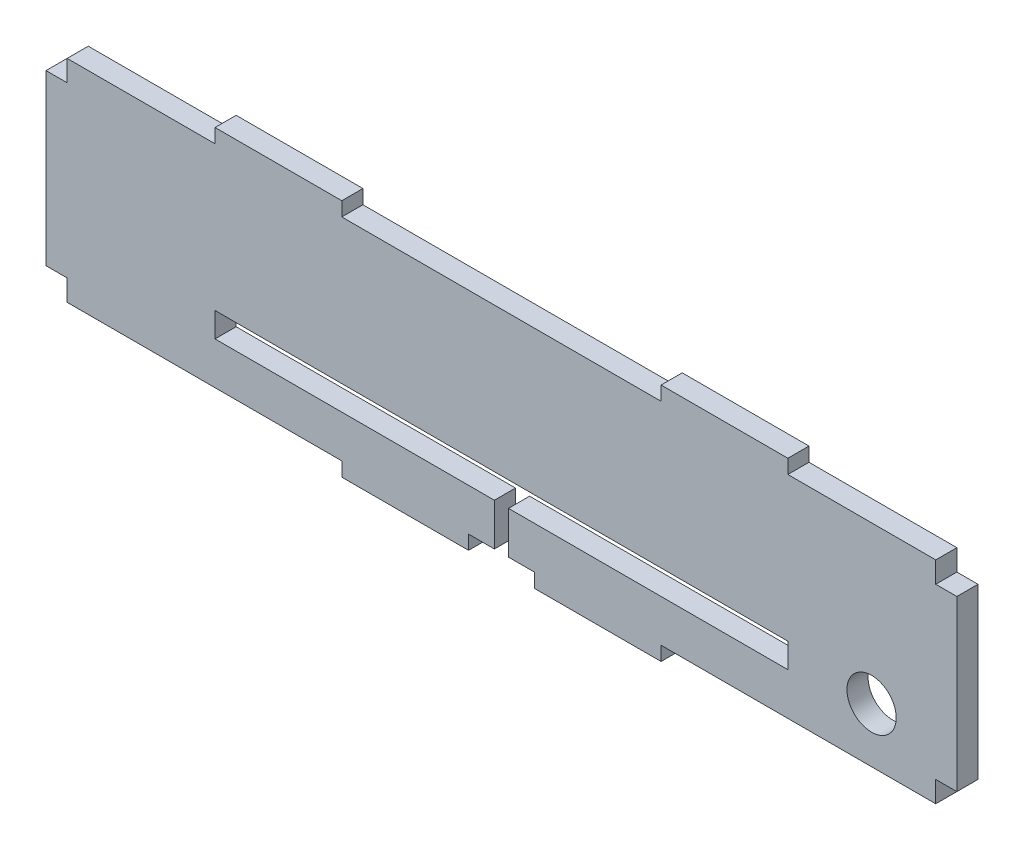
ISO-10303-21;
HEADER;
FILE_DESCRIPTION(('STEP AP214'),'2;1');
FILE_NAME('part.step','',(''),(''),'','','');
FILE_SCHEMA(('AUTOMOTIVE_DESIGN { 1 0 10303 214 1 1 1 1 }'));
ENDSEC;
DATA;
#1=APPLICATION_CONTEXT('core data for automotive mechanical design processes');
#2=APPLICATION_PROTOCOL_DEFINITION('international standard','automotive_design',2000,#1);
#3=PRODUCT_CONTEXT('',#1,'mechanical');
#4=PRODUCT('Part','Part','',(#3));
#5=PRODUCT_RELATED_PRODUCT_CATEGORY('part','',(#4));
#6=PRODUCT_DEFINITION_FORMATION('','',#4);
#7=PRODUCT_DEFINITION_CONTEXT('part definition',#1,'design');
#8=PRODUCT_DEFINITION('design','',#6,#7);
#9=PRODUCT_DEFINITION_SHAPE('','',#8);
#10=(LENGTH_UNIT() NAMED_UNIT(*) SI_UNIT(.MILLI.,.METRE.));
#11=(NAMED_UNIT(*) PLANE_ANGLE_UNIT() SI_UNIT($,.RADIAN.));
#12=(NAMED_UNIT(*) SI_UNIT($,.STERADIAN.) SOLID_ANGLE_UNIT());
#13=UNCERTAINTY_MEASURE_WITH_UNIT(LENGTH_MEASURE(1.E-05),#10,'distance_accuracy_value','');
#14=(GEOMETRIC_REPRESENTATION_CONTEXT(3) GLOBAL_UNCERTAINTY_ASSIGNED_CONTEXT((#13)) GLOBAL_UNIT_ASSIGNED_CONTEXT((#10,
#11,#12)) REPRESENTATION_CONTEXT('',''));
#15=CARTESIAN_POINT('',(0.,0.,0.));
#16=DIRECTION('',(0.,0.,1.));
#17=DIRECTION('',(1.,0.,0.));
#18=AXIS2_PLACEMENT_3D('',#15,#16,#17);
#19=CARTESIAN_POINT('',(0.,30.,3.));
#20=DIRECTION('',(0.,1.,0.));
#21=DIRECTION('',(0.,0.,1.));
#22=AXIS2_PLACEMENT_3D('',#19,#20,#21);
#23=PLANE('',#22);
#24=DIRECTION('',(1.,0.,0.));
#25=VECTOR('',#24,1.);
#26=CARTESIAN_POINT('',(0.,30.,0.));
#27=LINE('',#26,#25);
#28=CARTESIAN_POINT('',(3.,30.,0.));
#29=VERTEX_POINT('',#28);
#30=CARTESIAN_POINT('',(24.,30.,0.));
#31=VERTEX_POINT('',#30);
#32=EDGE_CURVE('E389',#29,#31,#27,.T.);
#33=ORIENTED_EDGE('',*,*,#32,.F.);
#34=DIRECTION('',(0.,0.,-1.));
#35=VECTOR('',#34,1.);
#36=CARTESIAN_POINT('',(3.,30.,3.));
#37=LINE('',#36,#35);
#38=CARTESIAN_POINT('',(3.,30.,3.));
#39=VERTEX_POINT('',#38);
#40=EDGE_CURVE('E11',#39,#29,#37,.T.);
#41=ORIENTED_EDGE('',*,*,#40,.F.);
#42=DIRECTION('',(1.,0.,0.));
#43=VECTOR('',#42,1.);
#44=CARTESIAN_POINT('',(0.,30.,3.));
#45=LINE('',#44,#43);
#46=CARTESIAN_POINT('',(24.,30.,3.));
#47=VERTEX_POINT('',#46);
#48=EDGE_CURVE('E1070',#39,#47,#45,.T.);
#49=ORIENTED_EDGE('',*,*,#48,.T.);
#50=DIRECTION('',(0.,0.,-1.));
#51=VECTOR('',#50,1.);
#52=CARTESIAN_POINT('',(24.,30.,3.));
#53=LINE('',#52,#51);
#54=EDGE_CURVE('E54',#47,#31,#53,.T.);
#55=ORIENTED_EDGE('',*,*,#54,.T.);
#56=EDGE_LOOP('',(#33,#41,#49,#55));
#57=FACE_BOUND('',#56,.T.);
#58=ADVANCED_FACE('F37',(#57),#23,.T.);
#59=CARTESIAN_POINT('',(3.,0.,3.));
#60=DIRECTION('',(1.,0.,0.));
#61=DIRECTION('',(0.,0.,-1.));
#62=AXIS2_PLACEMENT_3D('',#59,#60,#61);
#63=PLANE('',#62);
#64=DIRECTION('',(0.,-1.,0.));
#65=VECTOR('',#64,1.);
#66=CARTESIAN_POINT('',(3.,0.,0.));
#67=LINE('',#66,#65);
#68=CARTESIAN_POINT('',(3.,27.,0.));
#69=VERTEX_POINT('',#68);
#70=EDGE_CURVE('E386',#29,#69,#67,.T.);
#71=ORIENTED_EDGE('',*,*,#70,.T.);
#72=DIRECTION('',(0.,0.,-1.));
#73=VECTOR('',#72,1.);
#74=CARTESIAN_POINT('',(3.,27.,3.));
#75=LINE('',#74,#73);
#76=CARTESIAN_POINT('',(3.,27.,3.));
#77=VERTEX_POINT('',#76);
#78=EDGE_CURVE('E46',#77,#69,#75,.T.);
#79=ORIENTED_EDGE('',*,*,#78,.F.);
#80=DIRECTION('',(0.,-1.,0.));
#81=VECTOR('',#80,1.);
#82=CARTESIAN_POINT('',(3.,0.,3.));
#83=LINE('',#82,#81);
#84=EDGE_CURVE('E1068',#39,#77,#83,.T.);
#85=ORIENTED_EDGE('',*,*,#84,.F.);
#86=ORIENTED_EDGE('',*,*,#40,.T.);
#87=EDGE_LOOP('',(#71,#79,#85,#86));
#88=FACE_BOUND('',#87,.T.);
#89=ADVANCED_FACE('F387',(#88),#63,.F.);
#90=CARTESIAN_POINT('',(0.,27.,3.));
#91=DIRECTION('',(0.,1.,0.));
#92=DIRECTION('',(0.,0.,1.));
#93=AXIS2_PLACEMENT_3D('',#90,#91,#92);
#94=PLANE('',#93);
#95=DIRECTION('',(1.,0.,0.));
#96=VECTOR('',#95,1.);
#97=CARTESIAN_POINT('',(0.,27.,0.));
#98=LINE('',#97,#96);
#99=CARTESIAN_POINT('',(0.,27.,0.));
#100=VERTEX_POINT('',#99);
#101=EDGE_CURVE('E380',#100,#69,#98,.T.);
#102=ORIENTED_EDGE('',*,*,#101,.F.);
#103=DIRECTION('',(0.,0.,-1.));
#104=VECTOR('',#103,1.);
#105=CARTESIAN_POINT('',(0.,27.,3.));
#106=LINE('',#105,#104);
#107=CARTESIAN_POINT('',(0.,27.,3.));
#108=VERTEX_POINT('',#107);
#109=EDGE_CURVE('E372',#108,#100,#106,.T.);
#110=ORIENTED_EDGE('',*,*,#109,.F.);
#111=DIRECTION('',(1.,0.,0.));
#112=VECTOR('',#111,1.);
#113=CARTESIAN_POINT('',(0.,27.,3.));
#114=LINE('',#113,#112);
#115=EDGE_CURVE('E383',#108,#77,#114,.T.);
#116=ORIENTED_EDGE('',*,*,#115,.T.);
#117=ORIENTED_EDGE('',*,*,#78,.T.);
#118=EDGE_LOOP('',(#102,#110,#116,#117));
#119=FACE_BOUND('',#118,.T.);
#120=ADVANCED_FACE('F378',(#119),#94,.T.);
#121=CARTESIAN_POINT('',(0.,0.,3.));
#122=DIRECTION('',(-1.,0.,0.));
#123=DIRECTION('',(0.,0.,1.));
#124=AXIS2_PLACEMENT_3D('',#121,#122,#123);
#125=PLANE('',#124);
#126=DIRECTION('',(0.,1.,0.));
#127=VECTOR('',#126,1.);
#128=CARTESIAN_POINT('',(0.,0.,0.));
#129=LINE('',#128,#127);
#130=CARTESIAN_POINT('',(0.,3.,0.));
#131=VERTEX_POINT('',#130);
#132=EDGE_CURVE('E394',#131,#100,#129,.T.);
#133=ORIENTED_EDGE('',*,*,#132,.F.);
#134=DIRECTION('',(0.,0.,-1.));
#135=VECTOR('',#134,1.);
#136=CARTESIAN_POINT('',(0.,3.,3.));
#137=LINE('',#136,#135);
#138=CARTESIAN_POINT('',(0.,3.,3.));
#139=VERTEX_POINT('',#138);
#140=EDGE_CURVE('E370',#139,#131,#137,.T.);
#141=ORIENTED_EDGE('',*,*,#140,.F.);
#142=DIRECTION('',(0.,1.,0.));
#143=VECTOR('',#142,1.);
#144=CARTESIAN_POINT('',(0.,0.,3.));
#145=LINE('',#144,#143);
#146=EDGE_CURVE('E1064',#139,#108,#145,.T.);
#147=ORIENTED_EDGE('',*,*,#146,.T.);
#148=ORIENTED_EDGE('',*,*,#109,.T.);
#149=EDGE_LOOP('',(#133,#141,#147,#148));
#150=FACE_BOUND('',#149,.T.);
#151=ADVANCED_FACE('F514',(#150),#125,.T.);
#152=CARTESIAN_POINT('',(0.,3.,3.));
#153=DIRECTION('',(0.,1.,0.));
#154=DIRECTION('',(0.,0.,1.));
#155=AXIS2_PLACEMENT_3D('',#152,#153,#154);
#156=PLANE('',#155);
#157=DIRECTION('',(1.,0.,0.));
#158=VECTOR('',#157,1.);
#159=CARTESIAN_POINT('',(0.,3.,0.));
#160=LINE('',#159,#158);
#161=CARTESIAN_POINT('',(3.,3.,0.));
#162=VERTEX_POINT('',#161);
#163=EDGE_CURVE('E396',#131,#162,#160,.T.);
#164=ORIENTED_EDGE('',*,*,#163,.T.);
#165=DIRECTION('',(0.,0.,-1.));
#166=VECTOR('',#165,1.);
#167=CARTESIAN_POINT('',(3.,3.,3.));
#168=LINE('',#167,#166);
#169=CARTESIAN_POINT('',(3.,3.,3.));
#170=VERTEX_POINT('',#169);
#171=EDGE_CURVE('E368',#170,#162,#168,.T.);
#172=ORIENTED_EDGE('',*,*,#171,.F.);
#173=DIRECTION('',(1.,0.,0.));
#174=VECTOR('',#173,1.);
#175=CARTESIAN_POINT('',(0.,3.,3.));
#176=LINE('',#175,#174);
#177=EDGE_CURVE('E1062',#139,#170,#176,.T.);
#178=ORIENTED_EDGE('',*,*,#177,.F.);
#179=ORIENTED_EDGE('',*,*,#140,.T.);
#180=EDGE_LOOP('',(#164,#172,#178,#179));
#181=FACE_BOUND('',#180,.T.);
#182=ADVANCED_FACE('F517',(#181),#156,.F.);
#183=CARTESIAN_POINT('',(3.,0.,3.));
#184=DIRECTION('',(-1.,0.,0.));
#185=DIRECTION('',(0.,0.,1.));
#186=AXIS2_PLACEMENT_3D('',#183,#184,#185);
#187=PLANE('',#186);
#188=DIRECTION('',(0.,1.,0.));
#189=VECTOR('',#188,1.);
#190=CARTESIAN_POINT('',(3.,0.,0.));
#191=LINE('',#190,#189);
#192=CARTESIAN_POINT('',(3.,0.,0.));
#193=VERTEX_POINT('',#192);
#194=EDGE_CURVE('E402',#193,#162,#191,.T.);
#195=ORIENTED_EDGE('',*,*,#194,.F.);
#196=DIRECTION('',(0.,0.,-1.));
#197=VECTOR('',#196,1.);
#198=CARTESIAN_POINT('',(3.,0.,3.));
#199=LINE('',#198,#197);
#200=CARTESIAN_POINT('',(3.,0.,3.));
#201=VERTEX_POINT('',#200);
#202=EDGE_CURVE('E366',#201,#193,#199,.T.);
#203=ORIENTED_EDGE('',*,*,#202,.F.);
#204=DIRECTION('',(0.,1.,0.));
#205=VECTOR('',#204,1.);
#206=CARTESIAN_POINT('',(3.,0.,3.));
#207=LINE('',#206,#205);
#208=EDGE_CURVE('E1059',#201,#170,#207,.T.);
#209=ORIENTED_EDGE('',*,*,#208,.T.);
#210=ORIENTED_EDGE('',*,*,#171,.T.);
#211=EDGE_LOOP('',(#195,#203,#209,#210));
#212=FACE_BOUND('',#211,.T.);
#213=ADVANCED_FACE('F521',(#212),#187,.T.);
#214=CARTESIAN_POINT('',(0.,0.,3.));
#215=DIRECTION('',(0.,1.,0.));
#216=DIRECTION('',(0.,0.,1.));
#217=AXIS2_PLACEMENT_3D('',#214,#215,#216);
#218=PLANE('',#217);
#219=DIRECTION('',(1.,0.,0.));
#220=VECTOR('',#219,1.);
#221=CARTESIAN_POINT('',(0.,0.,0.));
#222=LINE('',#221,#220);
#223=CARTESIAN_POINT('',(42.,0.,0.));
#224=VERTEX_POINT('',#223);
#225=EDGE_CURVE('E405',#193,#224,#222,.T.);
#226=ORIENTED_EDGE('',*,*,#225,.T.);
#227=DIRECTION('',(0.,0.,-1.));
#228=VECTOR('',#227,1.);
#229=CARTESIAN_POINT('',(42.,0.,3.));
#230=LINE('',#229,#228);
#231=CARTESIAN_POINT('',(42.,0.,3.));
#232=VERTEX_POINT('',#231);
#233=EDGE_CURVE('E363',#232,#224,#230,.T.);
#234=ORIENTED_EDGE('',*,*,#233,.F.);
#235=DIRECTION('',(1.,0.,0.));
#236=VECTOR('',#235,1.);
#237=CARTESIAN_POINT('',(0.,0.,3.));
#238=LINE('',#237,#236);
#239=EDGE_CURVE('E1056',#201,#232,#238,.T.);
#240=ORIENTED_EDGE('',*,*,#239,.F.);
#241=ORIENTED_EDGE('',*,*,#202,.T.);
#242=EDGE_LOOP('',(#226,#234,#240,#241));
#243=FACE_BOUND('',#242,.T.);
#244=ADVANCED_FACE('F525',(#243),#218,.F.);
#245=CARTESIAN_POINT('',(42.,2.91433543964104E-13,3.));
#246=DIRECTION('',(1.,0.,0.));
#247=DIRECTION('',(0.,1.,0.));
#248=AXIS2_PLACEMENT_3D('',#245,#246,#247);
#249=PLANE('',#248);
#250=DIRECTION('',(0.,-1.,0.));
#251=VECTOR('',#250,1.);
#252=CARTESIAN_POINT('',(42.,2.91433543964104E-13,0.));
#253=LINE('',#252,#251);
#254=CARTESIAN_POINT('',(42.,-2.,0.));
#255=VERTEX_POINT('',#254);
#256=EDGE_CURVE('E408',#224,#255,#253,.T.);
#257=ORIENTED_EDGE('',*,*,#256,.T.);
#258=DIRECTION('',(0.,0.,-1.));
#259=VECTOR('',#258,1.);
#260=CARTESIAN_POINT('',(42.,-2.,3.));
#261=LINE('',#260,#259);
#262=CARTESIAN_POINT('',(42.,-2.,3.));
#263=VERTEX_POINT('',#262);
#264=EDGE_CURVE('E360',#263,#255,#261,.T.);
#265=ORIENTED_EDGE('',*,*,#264,.F.);
#266=DIRECTION('',(0.,-1.,0.));
#267=VECTOR('',#266,1.);
#268=CARTESIAN_POINT('',(42.,2.91433543964104E-13,3.));
#269=LINE('',#268,#267);
#270=EDGE_CURVE('E1053',#232,#263,#269,.T.);
#271=ORIENTED_EDGE('',*,*,#270,.F.);
#272=ORIENTED_EDGE('',*,*,#233,.T.);
#273=EDGE_LOOP('',(#257,#265,#271,#272));
#274=FACE_BOUND('',#273,.T.);
#275=ADVANCED_FACE('F529',(#274),#249,.F.);
#276=CARTESIAN_POINT('',(0.,-2.,3.));
#277=DIRECTION('',(0.,1.,0.));
#278=DIRECTION('',(-1.,0.,0.));
#279=AXIS2_PLACEMENT_3D('',#276,#277,#278);
#280=PLANE('',#279);
#281=DIRECTION('',(1.,0.,0.));
#282=VECTOR('',#281,1.);
#283=CARTESIAN_POINT('',(0.,-2.,0.));
#284=LINE('',#283,#282);
#285=CARTESIAN_POINT('',(60.,-2.,0.));
#286=VERTEX_POINT('',#285);
#287=EDGE_CURVE('E411',#255,#286,#284,.T.);
#288=ORIENTED_EDGE('',*,*,#287,.T.);
#289=DIRECTION('',(0.,0.,-1.));
#290=VECTOR('',#289,1.);
#291=CARTESIAN_POINT('',(60.,-2.,3.));
#292=LINE('',#291,#290);
#293=CARTESIAN_POINT('',(60.,-2.,3.));
#294=VERTEX_POINT('',#293);
#295=EDGE_CURVE('E357',#294,#286,#292,.T.);
#296=ORIENTED_EDGE('',*,*,#295,.F.);
#297=DIRECTION('',(1.,0.,0.));
#298=VECTOR('',#297,1.);
#299=CARTESIAN_POINT('',(0.,-2.,3.));
#300=LINE('',#299,#298);
#301=EDGE_CURVE('E961',#263,#294,#300,.T.);
#302=ORIENTED_EDGE('',*,*,#301,.F.);
#303=ORIENTED_EDGE('',*,*,#264,.T.);
#304=EDGE_LOOP('',(#288,#296,#302,#303));
#305=FACE_BOUND('',#304,.T.);
#306=ADVANCED_FACE('F533',(#305),#280,.F.);
#307=CARTESIAN_POINT('',(60.,4.16333634234434E-13,3.));
#308=DIRECTION('',(-1.,0.,0.));
#309=DIRECTION('',(0.,-1.,0.));
#310=AXIS2_PLACEMENT_3D('',#307,#308,#309);
#311=PLANE('',#310);
#312=DIRECTION('',(0.,1.,0.));
#313=VECTOR('',#312,1.);
#314=CARTESIAN_POINT('',(60.,4.16333634234434E-13,0.));
#315=LINE('',#314,#313);
#316=CARTESIAN_POINT('',(60.,0.,0.));
#317=VERTEX_POINT('',#316);
#318=EDGE_CURVE('E414',#286,#317,#315,.T.);
#319=ORIENTED_EDGE('',*,*,#318,.T.);
#320=DIRECTION('',(0.,0.,-1.));
#321=VECTOR('',#320,1.);
#322=CARTESIAN_POINT('',(60.,0.,3.));
#323=LINE('',#322,#321);
#324=CARTESIAN_POINT('',(60.,0.,3.));
#325=VERTEX_POINT('',#324);
#326=EDGE_CURVE('E354',#325,#317,#323,.T.);
#327=ORIENTED_EDGE('',*,*,#326,.F.);
#328=DIRECTION('',(0.,1.,0.));
#329=VECTOR('',#328,1.);
#330=CARTESIAN_POINT('',(60.,4.16333634234434E-13,3.));
#331=LINE('',#330,#329);
#332=EDGE_CURVE('E958',#294,#325,#331,.T.);
#333=ORIENTED_EDGE('',*,*,#332,.F.);
#334=ORIENTED_EDGE('',*,*,#295,.T.);
#335=EDGE_LOOP('',(#319,#327,#333,#334));
#336=FACE_BOUND('',#335,.T.);
#337=ADVANCED_FACE('F537',(#336),#311,.F.);
#338=CARTESIAN_POINT('',(0.,0.,3.));
#339=DIRECTION('',(0.,1.,0.));
#340=DIRECTION('',(0.,0.,1.));
#341=AXIS2_PLACEMENT_3D('',#338,#339,#340);
#342=PLANE('',#341);
#343=DIRECTION('',(1.,0.,0.));
#344=VECTOR('',#343,1.);
#345=CARTESIAN_POINT('',(0.,0.,0.));
#346=LINE('',#345,#344);
#347=CARTESIAN_POINT('',(63.67,0.,0.));
#348=VERTEX_POINT('',#347);
#349=EDGE_CURVE('E417',#317,#348,#346,.T.);
#350=ORIENTED_EDGE('',*,*,#349,.T.);
#351=DIRECTION('',(0.,0.,-1.));
#352=VECTOR('',#351,1.);
#353=CARTESIAN_POINT('',(63.67,0.,3.));
#354=LINE('',#353,#352);
#355=CARTESIAN_POINT('',(63.67,0.,3.));
#356=VERTEX_POINT('',#355);
#357=EDGE_CURVE('E351',#356,#348,#354,.T.);
#358=ORIENTED_EDGE('',*,*,#357,.F.);
#359=DIRECTION('',(1.,0.,0.));
#360=VECTOR('',#359,1.);
#361=CARTESIAN_POINT('',(0.,0.,3.));
#362=LINE('',#361,#360);
#363=EDGE_CURVE('E954',#325,#356,#362,.T.);
#364=ORIENTED_EDGE('',*,*,#363,.F.);
#365=ORIENTED_EDGE('',*,*,#326,.T.);
#366=EDGE_LOOP('',(#350,#358,#364,#365));
#367=FACE_BOUND('',#366,.T.);
#368=ADVANCED_FACE('F541',(#367),#342,.F.);
#369=CARTESIAN_POINT('',(63.67,0.,3.));
#370=DIRECTION('',(-1.,0.,0.));
#371=DIRECTION('',(0.,0.,1.));
#372=AXIS2_PLACEMENT_3D('',#369,#370,#371);
#373=PLANE('',#372);
#374=DIRECTION('',(0.,1.,0.));
#375=VECTOR('',#374,1.);
#376=CARTESIAN_POINT('',(63.67,0.,0.));
#377=LINE('',#376,#375);
#378=CARTESIAN_POINT('',(63.67,6.,0.));
#379=VERTEX_POINT('',#378);
#380=EDGE_CURVE('E420',#348,#379,#377,.T.);
#381=ORIENTED_EDGE('',*,*,#380,.T.);
#382=DIRECTION('',(0.,0.,-1.));
#383=VECTOR('',#382,1.);
#384=CARTESIAN_POINT('',(63.67,6.,3.));
#385=LINE('',#384,#383);
#386=CARTESIAN_POINT('',(63.67,6.,3.));
#387=VERTEX_POINT('',#386);
#388=EDGE_CURVE('E349',#387,#379,#385,.T.);
#389=ORIENTED_EDGE('',*,*,#388,.F.);
#390=DIRECTION('',(0.,1.,0.));
#391=VECTOR('',#390,1.);
#392=CARTESIAN_POINT('',(63.67,0.,3.));
#393=LINE('',#392,#391);
#394=EDGE_CURVE('E949',#356,#387,#393,.T.);
#395=ORIENTED_EDGE('',*,*,#394,.F.);
#396=ORIENTED_EDGE('',*,*,#357,.T.);
#397=EDGE_LOOP('',(#381,#389,#395,#396));
#398=FACE_BOUND('',#397,.T.);
#399=ADVANCED_FACE('F543',(#398),#373,.F.);
#400=CARTESIAN_POINT('',(0.,6.,3.));
#401=DIRECTION('',(0.,1.,0.));
#402=DIRECTION('',(0.,0.,1.));
#403=AXIS2_PLACEMENT_3D('',#400,#401,#402);
#404=PLANE('',#403);
#405=DIRECTION('',(1.,0.,0.));
#406=VECTOR('',#405,1.);
#407=CARTESIAN_POINT('',(0.,6.,0.));
#408=LINE('',#407,#406);
#409=CARTESIAN_POINT('',(24.,6.,0.));
#410=VERTEX_POINT('',#409);
#411=EDGE_CURVE('E424',#410,#379,#408,.T.);
#412=ORIENTED_EDGE('',*,*,#411,.F.);
#413=DIRECTION('',(0.,0.,-1.));
#414=VECTOR('',#413,1.);
#415=CARTESIAN_POINT('',(24.,6.,3.));
#416=LINE('',#415,#414);
#417=CARTESIAN_POINT('',(24.,6.,3.));
#418=VERTEX_POINT('',#417);
#419=EDGE_CURVE('E347',#418,#410,#416,.T.);
#420=ORIENTED_EDGE('',*,*,#419,.F.);
#421=DIRECTION('',(1.,0.,0.));
#422=VECTOR('',#421,1.);
#423=CARTESIAN_POINT('',(0.,6.,3.));
#424=LINE('',#423,#422);
#425=EDGE_CURVE('E953',#418,#387,#424,.T.);
#426=ORIENTED_EDGE('',*,*,#425,.T.);
#427=ORIENTED_EDGE('',*,*,#388,.T.);
#428=EDGE_LOOP('',(#412,#420,#426,#427));
#429=FACE_BOUND('',#428,.T.);
#430=ADVANCED_FACE('F546',(#429),#404,.T.);
#431=CARTESIAN_POINT('',(24.,0.,3.));
#432=DIRECTION('',(1.,0.,0.));
#433=DIRECTION('',(0.,0.,-1.));
#434=AXIS2_PLACEMENT_3D('',#431,#432,#433);
#435=PLANE('',#434);
#436=DIRECTION('',(0.,-1.,0.));
#437=VECTOR('',#436,1.);
#438=CARTESIAN_POINT('',(24.,0.,0.));
#439=LINE('',#438,#437);
#440=CARTESIAN_POINT('',(24.,9.5,0.));
#441=VERTEX_POINT('',#440);
#442=EDGE_CURVE('E427',#441,#410,#439,.T.);
#443=ORIENTED_EDGE('',*,*,#442,.F.);
#444=DIRECTION('',(0.,0.,-1.));
#445=VECTOR('',#444,1.);
#446=CARTESIAN_POINT('',(24.,9.5,3.));
#447=LINE('',#446,#445);
#448=CARTESIAN_POINT('',(24.,9.5,3.));
#449=VERTEX_POINT('',#448);
#450=EDGE_CURVE('E345',#449,#441,#447,.T.);
#451=ORIENTED_EDGE('',*,*,#450,.F.);
#452=DIRECTION('',(0.,-1.,0.));
#453=VECTOR('',#452,1.);
#454=CARTESIAN_POINT('',(24.,0.,3.));
#455=LINE('',#454,#453);
#456=EDGE_CURVE('E1046',#449,#418,#455,.T.);
#457=ORIENTED_EDGE('',*,*,#456,.T.);
#458=ORIENTED_EDGE('',*,*,#419,.T.);
#459=EDGE_LOOP('',(#443,#451,#457,#458));
#460=FACE_BOUND('',#459,.T.);
#461=ADVANCED_FACE('F550',(#460),#435,.T.);
#462=CARTESIAN_POINT('',(0.,9.5,3.));
#463=DIRECTION('',(0.,1.,0.));
#464=DIRECTION('',(0.,0.,1.));
#465=AXIS2_PLACEMENT_3D('',#462,#463,#464);
#466=PLANE('',#465);
#467=DIRECTION('',(1.,0.,0.));
#468=VECTOR('',#467,1.);
#469=CARTESIAN_POINT('',(0.,9.5,0.));
#470=LINE('',#469,#468);
#471=CARTESIAN_POINT('',(105.34,9.5,0.));
#472=VERTEX_POINT('',#471);
#473=EDGE_CURVE('E430',#441,#472,#470,.T.);
#474=ORIENTED_EDGE('',*,*,#473,.T.);
#475=DIRECTION('',(0.,0.,-1.));
#476=VECTOR('',#475,1.);
#477=CARTESIAN_POINT('',(105.34,9.5,3.));
#478=LINE('',#477,#476);
#479=CARTESIAN_POINT('',(105.34,9.5,3.));
#480=VERTEX_POINT('',#479);
#481=EDGE_CURVE('E342',#480,#472,#478,.T.);
#482=ORIENTED_EDGE('',*,*,#481,.F.);
#483=DIRECTION('',(1.,0.,0.));
#484=VECTOR('',#483,1.);
#485=CARTESIAN_POINT('',(0.,9.5,3.));
#486=LINE('',#485,#484);
#487=EDGE_CURVE('E1048',#449,#480,#486,.T.);
#488=ORIENTED_EDGE('',*,*,#487,.F.);
#489=ORIENTED_EDGE('',*,*,#450,.T.);
#490=EDGE_LOOP('',(#474,#482,#488,#489));
#491=FACE_BOUND('',#490,.T.);
#492=ADVANCED_FACE('F554',(#491),#466,.F.);
#493=CARTESIAN_POINT('',(105.34,0.,3.));
#494=DIRECTION('',(1.,0.,0.));
#495=DIRECTION('',(0.,0.,-1.));
#496=AXIS2_PLACEMENT_3D('',#493,#494,#495);
#497=PLANE('',#496);
#498=DIRECTION('',(0.,-1.,0.));
#499=VECTOR('',#498,1.);
#500=CARTESIAN_POINT('',(105.34,0.,0.));
#501=LINE('',#500,#499);
#502=CARTESIAN_POINT('',(105.34,6.,0.));
#503=VERTEX_POINT('',#502);
#504=EDGE_CURVE('E433',#472,#503,#501,.T.);
#505=ORIENTED_EDGE('',*,*,#504,.T.);
#506=DIRECTION('',(0.,0.,-1.));
#507=VECTOR('',#506,1.);
#508=CARTESIAN_POINT('',(105.34,6.,3.));
#509=LINE('',#508,#507);
#510=CARTESIAN_POINT('',(105.34,6.,3.));
#511=VERTEX_POINT('',#510);
#512=EDGE_CURVE('E340',#511,#503,#509,.T.);
#513=ORIENTED_EDGE('',*,*,#512,.F.);
#514=DIRECTION('',(0.,-1.,0.));
#515=VECTOR('',#514,1.);
#516=CARTESIAN_POINT('',(105.34,0.,3.));
#517=LINE('',#516,#515);
#518=EDGE_CURVE('E976',#480,#511,#517,.T.);
#519=ORIENTED_EDGE('',*,*,#518,.F.);
#520=ORIENTED_EDGE('',*,*,#481,.T.);
#521=EDGE_LOOP('',(#505,#513,#519,#520));
#522=FACE_BOUND('',#521,.T.);
#523=ADVANCED_FACE('F558',(#522),#497,.F.);
#524=CARTESIAN_POINT('',(0.,6.,3.));
#525=DIRECTION('',(0.,1.,0.));
#526=DIRECTION('',(0.,0.,1.));
#527=AXIS2_PLACEMENT_3D('',#524,#525,#526);
#528=PLANE('',#527);
#529=DIRECTION('',(1.,0.,0.));
#530=VECTOR('',#529,1.);
#531=CARTESIAN_POINT('',(0.,6.,0.));
#532=LINE('',#531,#530);
#533=CARTESIAN_POINT('',(65.67,6.,0.));
#534=VERTEX_POINT('',#533);
#535=EDGE_CURVE('E436',#534,#503,#532,.T.);
#536=ORIENTED_EDGE('',*,*,#535,.F.);
#537=DIRECTION('',(0.,0.,-1.));
#538=VECTOR('',#537,1.);
#539=CARTESIAN_POINT('',(65.67,6.,3.));
#540=LINE('',#539,#538);
#541=CARTESIAN_POINT('',(65.67,6.,3.));
#542=VERTEX_POINT('',#541);
#543=EDGE_CURVE('E338',#542,#534,#540,.T.);
#544=ORIENTED_EDGE('',*,*,#543,.F.);
#545=DIRECTION('',(1.,0.,0.));
#546=VECTOR('',#545,1.);
#547=CARTESIAN_POINT('',(0.,6.,3.));
#548=LINE('',#547,#546);
#549=EDGE_CURVE('E973',#542,#511,#548,.T.);
#550=ORIENTED_EDGE('',*,*,#549,.T.);
#551=ORIENTED_EDGE('',*,*,#512,.T.);
#552=EDGE_LOOP('',(#536,#544,#550,#551));
#553=FACE_BOUND('',#552,.T.);
#554=ADVANCED_FACE('F562',(#553),#528,.T.);
#555=CARTESIAN_POINT('',(65.67,0.,3.));
#556=DIRECTION('',(-1.,0.,0.));
#557=DIRECTION('',(0.,0.,1.));
#558=AXIS2_PLACEMENT_3D('',#555,#556,#557);
#559=PLANE('',#558);
#560=DIRECTION('',(0.,1.,0.));
#561=VECTOR('',#560,1.);
#562=CARTESIAN_POINT('',(65.67,0.,0.));
#563=LINE('',#562,#561);
#564=CARTESIAN_POINT('',(65.67,0.,0.));
#565=VERTEX_POINT('',#564);
#566=EDGE_CURVE('E439',#565,#534,#563,.T.);
#567=ORIENTED_EDGE('',*,*,#566,.F.);
#568=DIRECTION('',(0.,0.,-1.));
#569=VECTOR('',#568,1.);
#570=CARTESIAN_POINT('',(65.67,0.,3.));
#571=LINE('',#570,#569);
#572=CARTESIAN_POINT('',(65.67,0.,3.));
#573=VERTEX_POINT('',#572);
#574=EDGE_CURVE('E336',#573,#565,#571,.T.);
#575=ORIENTED_EDGE('',*,*,#574,.F.);
#576=DIRECTION('',(0.,1.,0.));
#577=VECTOR('',#576,1.);
#578=CARTESIAN_POINT('',(65.67,0.,3.));
#579=LINE('',#578,#577);
#580=EDGE_CURVE('E965',#573,#542,#579,.T.);
#581=ORIENTED_EDGE('',*,*,#580,.T.);
#582=ORIENTED_EDGE('',*,*,#543,.T.);
#583=EDGE_LOOP('',(#567,#575,#581,#582));
#584=FACE_BOUND('',#583,.T.);
#585=ADVANCED_FACE('F566',(#584),#559,.T.);
#586=CARTESIAN_POINT('',(69.34,0.,0.));
#587=VERTEX_POINT('',#586);
#588=EDGE_CURVE('E421',#565,#587,#346,.T.);
#589=ORIENTED_EDGE('',*,*,#588,.T.);
#590=DIRECTION('',(0.,0.,-1.));
#591=VECTOR('',#590,1.);
#592=CARTESIAN_POINT('',(69.34,0.,3.));
#593=LINE('',#592,#591);
#594=CARTESIAN_POINT('',(69.34,0.,3.));
#595=VERTEX_POINT('',#594);
#596=EDGE_CURVE('E333',#595,#587,#593,.T.);
#597=ORIENTED_EDGE('',*,*,#596,.F.);
#598=EDGE_CURVE('E960',#573,#595,#362,.T.);
#599=ORIENTED_EDGE('',*,*,#598,.F.);
#600=ORIENTED_EDGE('',*,*,#574,.T.);
#601=EDGE_LOOP('',(#589,#597,#599,#600));
#602=FACE_BOUND('',#601,.T.);
#603=ADVANCED_FACE('F570',(#602),#342,.F.);
#604=CARTESIAN_POINT('',(69.34,0.,3.));
#605=DIRECTION('',(1.,0.,0.));
#606=DIRECTION('',(0.,0.,-1.));
#607=AXIS2_PLACEMENT_3D('',#604,#605,#606);
#608=PLANE('',#607);
#609=DIRECTION('',(0.,-1.,0.));
#610=VECTOR('',#609,1.);
#611=CARTESIAN_POINT('',(69.34,0.,0.));
#612=LINE('',#611,#610);
#613=CARTESIAN_POINT('',(69.34,-2.,0.));
#614=VERTEX_POINT('',#613);
#615=EDGE_CURVE('E442',#587,#614,#612,.T.);
#616=ORIENTED_EDGE('',*,*,#615,.T.);
#617=DIRECTION('',(0.,0.,-1.));
#618=VECTOR('',#617,1.);
#619=CARTESIAN_POINT('',(69.34,-2.,3.));
#620=LINE('',#619,#618);
#621=CARTESIAN_POINT('',(69.34,-2.,3.));
#622=VERTEX_POINT('',#621);
#623=EDGE_CURVE('E330',#622,#614,#620,.T.);
#624=ORIENTED_EDGE('',*,*,#623,.F.);
#625=DIRECTION('',(0.,-1.,0.));
#626=VECTOR('',#625,1.);
#627=CARTESIAN_POINT('',(69.34,0.,3.));
#628=LINE('',#627,#626);
#629=EDGE_CURVE('E964',#595,#622,#628,.T.);
#630=ORIENTED_EDGE('',*,*,#629,.F.);
#631=ORIENTED_EDGE('',*,*,#596,.T.);
#632=EDGE_LOOP('',(#616,#624,#630,#631));
#633=FACE_BOUND('',#632,.T.);
#634=ADVANCED_FACE('F574',(#633),#608,.F.);
#635=CARTESIAN_POINT('',(0.,-2.,3.));
#636=DIRECTION('',(0.,1.,0.));
#637=DIRECTION('',(0.,0.,1.));
#638=AXIS2_PLACEMENT_3D('',#635,#636,#637);
#639=PLANE('',#638);
#640=DIRECTION('',(1.,0.,0.));
#641=VECTOR('',#640,1.);
#642=CARTESIAN_POINT('',(0.,-2.,0.));
#643=LINE('',#642,#641);
#644=CARTESIAN_POINT('',(87.34,-2.,0.));
#645=VERTEX_POINT('',#644);
#646=EDGE_CURVE('E445',#614,#645,#643,.T.);
#647=ORIENTED_EDGE('',*,*,#646,.T.);
#648=DIRECTION('',(0.,0.,-1.));
#649=VECTOR('',#648,1.);
#650=CARTESIAN_POINT('',(87.34,-2.,3.));
#651=LINE('',#650,#649);
#652=CARTESIAN_POINT('',(87.34,-2.,3.));
#653=VERTEX_POINT('',#652);
#654=EDGE_CURVE('E327',#653,#645,#651,.T.);
#655=ORIENTED_EDGE('',*,*,#654,.F.);
#656=DIRECTION('',(1.,0.,0.));
#657=VECTOR('',#656,1.);
#658=CARTESIAN_POINT('',(0.,-2.,3.));
#659=LINE('',#658,#657);
#660=EDGE_CURVE('E970',#622,#653,#659,.T.);
#661=ORIENTED_EDGE('',*,*,#660,.F.);
#662=ORIENTED_EDGE('',*,*,#623,.T.);
#663=EDGE_LOOP('',(#647,#655,#661,#662));
#664=FACE_BOUND('',#663,.T.);
#665=ADVANCED_FACE('F578',(#664),#639,.F.);
#666=CARTESIAN_POINT('',(87.34,0.,3.));
#667=DIRECTION('',(-1.,0.,0.));
#668=DIRECTION('',(0.,0.,1.));
#669=AXIS2_PLACEMENT_3D('',#666,#667,#668);
#670=PLANE('',#669);
#671=DIRECTION('',(0.,1.,0.));
#672=VECTOR('',#671,1.);
#673=CARTESIAN_POINT('',(87.34,0.,0.));
#674=LINE('',#673,#672);
#675=CARTESIAN_POINT('',(87.34,0.,0.));
#676=VERTEX_POINT('',#675);
#677=EDGE_CURVE('E448',#645,#676,#674,.T.);
#678=ORIENTED_EDGE('',*,*,#677,.T.);
#679=DIRECTION('',(0.,0.,-1.));
#680=VECTOR('',#679,1.);
#681=CARTESIAN_POINT('',(87.34,0.,3.));
#682=LINE('',#681,#680);
#683=CARTESIAN_POINT('',(87.34,0.,3.));
#684=VERTEX_POINT('',#683);
#685=EDGE_CURVE('E324',#684,#676,#682,.T.);
#686=ORIENTED_EDGE('',*,*,#685,.F.);
#687=DIRECTION('',(0.,1.,0.));
#688=VECTOR('',#687,1.);
#689=CARTESIAN_POINT('',(87.34,0.,3.));
#690=LINE('',#689,#688);
#691=EDGE_CURVE('E982',#653,#684,#690,.T.);
#692=ORIENTED_EDGE('',*,*,#691,.F.);
#693=ORIENTED_EDGE('',*,*,#654,.T.);
#694=EDGE_LOOP('',(#678,#686,#692,#693));
#695=FACE_BOUND('',#694,.T.);
#696=ADVANCED_FACE('F582',(#695),#670,.F.);
#697=CARTESIAN_POINT('',(0.,0.,3.));
#698=DIRECTION('',(0.,1.,0.));
#699=DIRECTION('',(0.,0.,1.));
#700=AXIS2_PLACEMENT_3D('',#697,#698,#699);
#701=PLANE('',#700);
#702=DIRECTION('',(1.,0.,0.));
#703=VECTOR('',#702,1.);
#704=CARTESIAN_POINT('',(0.,0.,0.));
#705=LINE('',#704,#703);
#706=CARTESIAN_POINT('',(126.34,0.,0.));
#707=VERTEX_POINT('',#706);
#708=EDGE_CURVE('E451',#676,#707,#705,.T.);
#709=ORIENTED_EDGE('',*,*,#708,.T.);
#710=DIRECTION('',(0.,0.,-1.));
#711=VECTOR('',#710,1.);
#712=CARTESIAN_POINT('',(126.34,0.,3.));
#713=LINE('',#712,#711);
#714=CARTESIAN_POINT('',(126.34,0.,3.));
#715=VERTEX_POINT('',#714);
#716=EDGE_CURVE('E321',#715,#707,#713,.T.);
#717=ORIENTED_EDGE('',*,*,#716,.F.);
#718=DIRECTION('',(1.,0.,0.));
#719=VECTOR('',#718,1.);
#720=CARTESIAN_POINT('',(0.,0.,3.));
#721=LINE('',#720,#719);
#722=EDGE_CURVE('E985',#684,#715,#721,.T.);
#723=ORIENTED_EDGE('',*,*,#722,.F.);
#724=ORIENTED_EDGE('',*,*,#685,.T.);
#725=EDGE_LOOP('',(#709,#717,#723,#724));
#726=FACE_BOUND('',#725,.T.);
#727=ADVANCED_FACE('F586',(#726),#701,.F.);
#728=CARTESIAN_POINT('',(126.34,0.,3.));
#729=DIRECTION('',(-1.,0.,0.));
#730=DIRECTION('',(0.,0.,1.));
#731=AXIS2_PLACEMENT_3D('',#728,#729,#730);
#732=PLANE('',#731);
#733=DIRECTION('',(0.,1.,0.));
#734=VECTOR('',#733,1.);
#735=CARTESIAN_POINT('',(126.34,0.,0.));
#736=LINE('',#735,#734);
#737=CARTESIAN_POINT('',(126.34,3.,0.));
#738=VERTEX_POINT('',#737);
#739=EDGE_CURVE('E454',#707,#738,#736,.T.);
#740=ORIENTED_EDGE('',*,*,#739,.T.);
#741=DIRECTION('',(0.,0.,-1.));
#742=VECTOR('',#741,1.);
#743=CARTESIAN_POINT('',(126.34,3.,3.));
#744=LINE('',#743,#742);
#745=CARTESIAN_POINT('',(126.34,3.,3.));
#746=VERTEX_POINT('',#745);
#747=EDGE_CURVE('E319',#746,#738,#744,.T.);
#748=ORIENTED_EDGE('',*,*,#747,.F.);
#749=DIRECTION('',(0.,1.,0.));
#750=VECTOR('',#749,1.);
#751=CARTESIAN_POINT('',(126.34,0.,3.));
#752=LINE('',#751,#750);
#753=EDGE_CURVE('E988',#715,#746,#752,.T.);
#754=ORIENTED_EDGE('',*,*,#753,.F.);
#755=ORIENTED_EDGE('',*,*,#716,.T.);
#756=EDGE_LOOP('',(#740,#748,#754,#755));
#757=FACE_BOUND('',#756,.T.);
#758=ADVANCED_FACE('F590',(#757),#732,.F.);
#759=CARTESIAN_POINT('',(0.,3.,3.));
#760=DIRECTION('',(0.,-1.,0.));
#761=DIRECTION('',(0.,0.,-1.));
#762=AXIS2_PLACEMENT_3D('',#759,#760,#761);
#763=PLANE('',#762);
#764=DIRECTION('',(-1.,0.,0.));
#765=VECTOR('',#764,1.);
#766=CARTESIAN_POINT('',(0.,3.,0.));
#767=LINE('',#766,#765);
#768=CARTESIAN_POINT('',(129.34,3.,0.));
#769=VERTEX_POINT('',#768);
#770=EDGE_CURVE('E457',#769,#738,#767,.T.);
#771=ORIENTED_EDGE('',*,*,#770,.F.);
#772=DIRECTION('',(0.,0.,-1.));
#773=VECTOR('',#772,1.);
#774=CARTESIAN_POINT('',(129.34,3.,3.));
#775=LINE('',#774,#773);
#776=CARTESIAN_POINT('',(129.34,3.,3.));
#777=VERTEX_POINT('',#776);
#778=EDGE_CURVE('E317',#777,#769,#775,.T.);
#779=ORIENTED_EDGE('',*,*,#778,.F.);
#780=DIRECTION('',(-1.,0.,0.));
#781=VECTOR('',#780,1.);
#782=CARTESIAN_POINT('',(0.,3.,3.));
#783=LINE('',#782,#781);
#784=EDGE_CURVE('E990',#777,#746,#783,.T.);
#785=ORIENTED_EDGE('',*,*,#784,.T.);
#786=ORIENTED_EDGE('',*,*,#747,.T.);
#787=EDGE_LOOP('',(#771,#779,#785,#786));
#788=FACE_BOUND('',#787,.T.);
#789=ADVANCED_FACE('F594',(#788),#763,.T.);
#790=CARTESIAN_POINT('',(129.34,0.,3.));
#791=DIRECTION('',(-1.,0.,0.));
#792=DIRECTION('',(0.,0.,1.));
#793=AXIS2_PLACEMENT_3D('',#790,#791,#792);
#794=PLANE('',#793);
#795=DIRECTION('',(0.,1.,0.));
#796=VECTOR('',#795,1.);
#797=CARTESIAN_POINT('',(129.34,0.,0.));
#798=LINE('',#797,#796);
#799=CARTESIAN_POINT('',(129.34,27.,0.));
#800=VERTEX_POINT('',#799);
#801=EDGE_CURVE('E460',#769,#800,#798,.T.);
#802=ORIENTED_EDGE('',*,*,#801,.T.);
#803=DIRECTION('',(0.,0.,-1.));
#804=VECTOR('',#803,1.);
#805=CARTESIAN_POINT('',(129.34,27.,3.));
#806=LINE('',#805,#804);
#807=CARTESIAN_POINT('',(129.34,27.,3.));
#808=VERTEX_POINT('',#807);
#809=EDGE_CURVE('E314',#808,#800,#806,.T.);
#810=ORIENTED_EDGE('',*,*,#809,.F.);
#811=DIRECTION('',(0.,1.,0.));
#812=VECTOR('',#811,1.);
#813=CARTESIAN_POINT('',(129.34,0.,3.));
#814=LINE('',#813,#812);
#815=EDGE_CURVE('E993',#777,#808,#814,.T.);
#816=ORIENTED_EDGE('',*,*,#815,.F.);
#817=ORIENTED_EDGE('',*,*,#778,.T.);
#818=EDGE_LOOP('',(#802,#810,#816,#817));
#819=FACE_BOUND('',#818,.T.);
#820=ADVANCED_FACE('F598',(#819),#794,.F.);
#821=CARTESIAN_POINT('',(0.,27.,3.));
#822=DIRECTION('',(0.,-1.,0.));
#823=DIRECTION('',(0.,0.,-1.));
#824=AXIS2_PLACEMENT_3D('',#821,#822,#823);
#825=PLANE('',#824);
#826=DIRECTION('',(-1.,0.,0.));
#827=VECTOR('',#826,1.);
#828=CARTESIAN_POINT('',(0.,27.,0.));
#829=LINE('',#828,#827);
#830=CARTESIAN_POINT('',(126.34,27.,0.));
#831=VERTEX_POINT('',#830);
#832=EDGE_CURVE('E463',#800,#831,#829,.T.);
#833=ORIENTED_EDGE('',*,*,#832,.T.);
#834=DIRECTION('',(0.,0.,-1.));
#835=VECTOR('',#834,1.);
#836=CARTESIAN_POINT('',(126.34,27.,3.));
#837=LINE('',#836,#835);
#838=CARTESIAN_POINT('',(126.34,27.,3.));
#839=VERTEX_POINT('',#838);
#840=EDGE_CURVE('E312',#839,#831,#837,.T.);
#841=ORIENTED_EDGE('',*,*,#840,.F.);
#842=DIRECTION('',(-1.,0.,0.));
#843=VECTOR('',#842,1.);
#844=CARTESIAN_POINT('',(0.,27.,3.));
#845=LINE('',#844,#843);
#846=EDGE_CURVE('E996',#808,#839,#845,.T.);
#847=ORIENTED_EDGE('',*,*,#846,.F.);
#848=ORIENTED_EDGE('',*,*,#809,.T.);
#849=EDGE_LOOP('',(#833,#841,#847,#848));
#850=FACE_BOUND('',#849,.T.);
#851=ADVANCED_FACE('F602',(#850),#825,.F.);
#852=CARTESIAN_POINT('',(126.34,0.,3.));
#853=DIRECTION('',(1.,0.,0.));
#854=DIRECTION('',(0.,0.,-1.));
#855=AXIS2_PLACEMENT_3D('',#852,#853,#854);
#856=PLANE('',#855);
#857=DIRECTION('',(0.,-1.,0.));
#858=VECTOR('',#857,1.);
#859=CARTESIAN_POINT('',(126.34,0.,0.));
#860=LINE('',#859,#858);
#861=CARTESIAN_POINT('',(126.34,30.,0.));
#862=VERTEX_POINT('',#861);
#863=EDGE_CURVE('E466',#862,#831,#860,.T.);
#864=ORIENTED_EDGE('',*,*,#863,.F.);
#865=DIRECTION('',(0.,0.,-1.));
#866=VECTOR('',#865,1.);
#867=CARTESIAN_POINT('',(126.34,30.,3.));
#868=LINE('',#867,#866);
#869=CARTESIAN_POINT('',(126.34,30.,3.));
#870=VERTEX_POINT('',#869);
#871=EDGE_CURVE('E310',#870,#862,#868,.T.);
#872=ORIENTED_EDGE('',*,*,#871,.F.);
#873=DIRECTION('',(0.,-1.,0.));
#874=VECTOR('',#873,1.);
#875=CARTESIAN_POINT('',(126.34,0.,3.));
#876=LINE('',#875,#874);
#877=EDGE_CURVE('E998',#870,#839,#876,.T.);
#878=ORIENTED_EDGE('',*,*,#877,.T.);
#879=ORIENTED_EDGE('',*,*,#840,.T.);
#880=EDGE_LOOP('',(#864,#872,#878,#879));
#881=FACE_BOUND('',#880,.T.);
#882=ADVANCED_FACE('F606',(#881),#856,.T.);
#883=CARTESIAN_POINT('',(0.,30.,3.));
#884=DIRECTION('',(0.,-1.,0.));
#885=DIRECTION('',(0.,0.,-1.));
#886=AXIS2_PLACEMENT_3D('',#883,#884,#885);
#887=PLANE('',#886);
#888=DIRECTION('',(-1.,0.,0.));
#889=VECTOR('',#888,1.);
#890=CARTESIAN_POINT('',(0.,30.,0.));
#891=LINE('',#890,#889);
#892=CARTESIAN_POINT('',(105.34,30.,0.));
#893=VERTEX_POINT('',#892);
#894=EDGE_CURVE('E469',#862,#893,#891,.T.);
#895=ORIENTED_EDGE('',*,*,#894,.T.);
#896=DIRECTION('',(0.,0.,-1.));
#897=VECTOR('',#896,1.);
#898=CARTESIAN_POINT('',(105.34,30.,3.));
#899=LINE('',#898,#897);
#900=CARTESIAN_POINT('',(105.34,30.,3.));
#901=VERTEX_POINT('',#900);
#902=EDGE_CURVE('E307',#901,#893,#899,.T.);
#903=ORIENTED_EDGE('',*,*,#902,.F.);
#904=DIRECTION('',(-1.,0.,0.));
#905=VECTOR('',#904,1.);
#906=CARTESIAN_POINT('',(0.,30.,3.));
#907=LINE('',#906,#905);
#908=EDGE_CURVE('E1001',#870,#901,#907,.T.);
#909=ORIENTED_EDGE('',*,*,#908,.F.);
#910=ORIENTED_EDGE('',*,*,#871,.T.);
#911=EDGE_LOOP('',(#895,#903,#909,#910));
#912=FACE_BOUND('',#911,.T.);
#913=ADVANCED_FACE('F610',(#912),#887,.F.);
#914=CARTESIAN_POINT('',(105.34,0.,3.));
#915=DIRECTION('',(-1.,0.,0.));
#916=DIRECTION('',(0.,0.,1.));
#917=AXIS2_PLACEMENT_3D('',#914,#915,#916);
#918=PLANE('',#917);
#919=DIRECTION('',(0.,1.,0.));
#920=VECTOR('',#919,1.);
#921=CARTESIAN_POINT('',(105.34,0.,0.));
#922=LINE('',#921,#920);
#923=CARTESIAN_POINT('',(105.34,32.,0.));
#924=VERTEX_POINT('',#923);
#925=EDGE_CURVE('E472',#893,#924,#922,.T.);
#926=ORIENTED_EDGE('',*,*,#925,.T.);
#927=DIRECTION('',(0.,0.,-1.));
#928=VECTOR('',#927,1.);
#929=CARTESIAN_POINT('',(105.34,32.,3.));
#930=LINE('',#929,#928);
#931=CARTESIAN_POINT('',(105.34,32.,3.));
#932=VERTEX_POINT('',#931);
#933=EDGE_CURVE('E305',#932,#924,#930,.T.);
#934=ORIENTED_EDGE('',*,*,#933,.F.);
#935=DIRECTION('',(0.,1.,0.));
#936=VECTOR('',#935,1.);
#937=CARTESIAN_POINT('',(105.34,0.,3.));
#938=LINE('',#937,#936);
#939=EDGE_CURVE('E1004',#901,#932,#938,.T.);
#940=ORIENTED_EDGE('',*,*,#939,.F.);
#941=ORIENTED_EDGE('',*,*,#902,.T.);
#942=EDGE_LOOP('',(#926,#934,#940,#941));
#943=FACE_BOUND('',#942,.T.);
#944=ADVANCED_FACE('F614',(#943),#918,.F.);
#945=CARTESIAN_POINT('',(0.,32.,3.));
#946=DIRECTION('',(0.,1.,0.));
#947=DIRECTION('',(0.,0.,1.));
#948=AXIS2_PLACEMENT_3D('',#945,#946,#947);
#949=PLANE('',#948);
#950=DIRECTION('',(1.,0.,0.));
#951=VECTOR('',#950,1.);
#952=CARTESIAN_POINT('',(0.,32.,0.));
#953=LINE('',#952,#951);
#954=CARTESIAN_POINT('',(87.34,32.,0.));
#955=VERTEX_POINT('',#954);
#956=EDGE_CURVE('E475',#955,#924,#953,.T.);
#957=ORIENTED_EDGE('',*,*,#956,.F.);
#958=DIRECTION('',(0.,0.,-1.));
#959=VECTOR('',#958,1.);
#960=CARTESIAN_POINT('',(87.34,32.,3.));
#961=LINE('',#960,#959);
#962=CARTESIAN_POINT('',(87.34,32.,3.));
#963=VERTEX_POINT('',#962);
#964=EDGE_CURVE('E303',#963,#955,#961,.T.);
#965=ORIENTED_EDGE('',*,*,#964,.F.);
#966=DIRECTION('',(1.,0.,0.));
#967=VECTOR('',#966,1.);
#968=CARTESIAN_POINT('',(0.,32.,3.));
#969=LINE('',#968,#967);
#970=EDGE_CURVE('E1006',#963,#932,#969,.T.);
#971=ORIENTED_EDGE('',*,*,#970,.T.);
#972=ORIENTED_EDGE('',*,*,#933,.T.);
#973=EDGE_LOOP('',(#957,#965,#971,#972));
#974=FACE_BOUND('',#973,.T.);
#975=ADVANCED_FACE('F618',(#974),#949,.T.);
#976=CARTESIAN_POINT('',(87.34,0.,3.));
#977=DIRECTION('',(-1.,0.,0.));
#978=DIRECTION('',(0.,0.,1.));
#979=AXIS2_PLACEMENT_3D('',#976,#977,#978);
#980=PLANE('',#979);
#981=DIRECTION('',(0.,1.,0.));
#982=VECTOR('',#981,1.);
#983=CARTESIAN_POINT('',(87.34,0.,0.));
#984=LINE('',#983,#982);
#985=CARTESIAN_POINT('',(87.34,30.,0.));
#986=VERTEX_POINT('',#985);
#987=EDGE_CURVE('E478',#986,#955,#984,.T.);
#988=ORIENTED_EDGE('',*,*,#987,.F.);
#989=DIRECTION('',(0.,0.,-1.));
#990=VECTOR('',#989,1.);
#991=CARTESIAN_POINT('',(87.34,30.,3.));
#992=LINE('',#991,#990);
#993=CARTESIAN_POINT('',(87.34,30.,3.));
#994=VERTEX_POINT('',#993);
#995=EDGE_CURVE('E297',#994,#986,#992,.T.);
#996=ORIENTED_EDGE('',*,*,#995,.F.);
#997=DIRECTION('',(0.,1.,0.));
#998=VECTOR('',#997,1.);
#999=CARTESIAN_POINT('',(87.34,0.,3.));
#1000=LINE('',#999,#998);
#1001=EDGE_CURVE('E1009',#994,#963,#1000,.T.);
#1002=ORIENTED_EDGE('',*,*,#1001,.T.);
#1003=ORIENTED_EDGE('',*,*,#964,.T.);
#1004=EDGE_LOOP('',(#988,#996,#1002,#1003));
#1005=FACE_BOUND('',#1004,.T.);
#1006=ADVANCED_FACE('F622',(#1005),#980,.T.);
#1007=CARTESIAN_POINT('',(0.,30.,3.));
#1008=DIRECTION('',(0.,1.,0.));
#1009=DIRECTION('',(-1.,0.,0.));
#1010=AXIS2_PLACEMENT_3D('',#1007,#1008,#1009);
#1011=PLANE('',#1010);
#1012=DIRECTION('',(1.,0.,0.));
#1013=VECTOR('',#1012,1.);
#1014=CARTESIAN_POINT('',(0.,30.,0.));
#1015=LINE('',#1014,#1013);
#1016=CARTESIAN_POINT('',(42.,30.,0.));
#1017=VERTEX_POINT('',#1016);
#1018=EDGE_CURVE('E481',#1017,#986,#1015,.T.);
#1019=ORIENTED_EDGE('',*,*,#1018,.F.);
#1020=DIRECTION('',(0.,0.,-1.));
#1021=VECTOR('',#1020,1.);
#1022=CARTESIAN_POINT('',(42.,30.,3.));
#1023=LINE('',#1022,#1021);
#1024=CARTESIAN_POINT('',(42.,30.,3.));
#1025=VERTEX_POINT('',#1024);
#1026=EDGE_CURVE('E295',#1025,#1017,#1023,.T.);
#1027=ORIENTED_EDGE('',*,*,#1026,.F.);
#1028=DIRECTION('',(1.,0.,0.));
#1029=VECTOR('',#1028,1.);
#1030=CARTESIAN_POINT('',(0.,30.,3.));
#1031=LINE('',#1030,#1029);
#1032=EDGE_CURVE('E289',#1025,#994,#1031,.T.);
#1033=ORIENTED_EDGE('',*,*,#1032,.T.);
#1034=ORIENTED_EDGE('',*,*,#995,.T.);
#1035=EDGE_LOOP('',(#1019,#1027,#1033,#1034));
#1036=FACE_BOUND('',#1035,.T.);
#1037=ADVANCED_FACE('F626',(#1036),#1011,.T.);
#1038=CARTESIAN_POINT('',(42.,0.,3.));
#1039=DIRECTION('',(-1.,0.,0.));
#1040=DIRECTION('',(0.,0.,1.));
#1041=AXIS2_PLACEMENT_3D('',#1038,#1039,#1040);
#1042=PLANE('',#1041);
#1043=DIRECTION('',(0.,1.,0.));
#1044=VECTOR('',#1043,1.);
#1045=CARTESIAN_POINT('',(42.,0.,0.));
#1046=LINE('',#1045,#1044);
#1047=CARTESIAN_POINT('',(42.,32.,0.));
#1048=VERTEX_POINT('',#1047);
#1049=EDGE_CURVE('E294',#1017,#1048,#1046,.T.);
#1050=ORIENTED_EDGE('',*,*,#1049,.T.);
#1051=DIRECTION('',(0.,0.,-1.));
#1052=VECTOR('',#1051,1.);
#1053=CARTESIAN_POINT('',(42.,32.,3.));
#1054=LINE('',#1053,#1052);
#1055=CARTESIAN_POINT('',(42.,32.,3.));
#1056=VERTEX_POINT('',#1055);
#1057=EDGE_CURVE('E276',#1056,#1048,#1054,.T.);
#1058=ORIENTED_EDGE('',*,*,#1057,.F.);
#1059=DIRECTION('',(0.,1.,0.));
#1060=VECTOR('',#1059,1.);
#1061=CARTESIAN_POINT('',(42.,0.,3.));
#1062=LINE('',#1061,#1060);
#1063=EDGE_CURVE('E281',#1025,#1056,#1062,.T.);
#1064=ORIENTED_EDGE('',*,*,#1063,.F.);
#1065=ORIENTED_EDGE('',*,*,#1026,.T.);
#1066=EDGE_LOOP('',(#1050,#1058,#1064,#1065));
#1067=FACE_BOUND('',#1066,.T.);
#1068=ADVANCED_FACE('F292',(#1067),#1042,.F.);
#1069=CARTESIAN_POINT('',(0.,32.,3.));
#1070=DIRECTION('',(0.,-1.,0.));
#1071=DIRECTION('',(0.,0.,-1.));
#1072=AXIS2_PLACEMENT_3D('',#1069,#1070,#1071);
#1073=PLANE('',#1072);
#1074=DIRECTION('',(-1.,0.,0.));
#1075=VECTOR('',#1074,1.);
#1076=CARTESIAN_POINT('',(0.,32.,0.));
#1077=LINE('',#1076,#1075);
#1078=CARTESIAN_POINT('',(24.,32.,0.));
#1079=VERTEX_POINT('',#1078);
#1080=EDGE_CURVE('E485',#1048,#1079,#1077,.T.);
#1081=ORIENTED_EDGE('',*,*,#1080,.T.);
#1082=DIRECTION('',(0.,0.,-1.));
#1083=VECTOR('',#1082,1.);
#1084=CARTESIAN_POINT('',(24.,32.,3.));
#1085=LINE('',#1084,#1083);
#1086=CARTESIAN_POINT('',(24.,32.,3.));
#1087=VERTEX_POINT('',#1086);
#1088=EDGE_CURVE('E164',#1087,#1079,#1085,.T.);
#1089=ORIENTED_EDGE('',*,*,#1088,.F.);
#1090=DIRECTION('',(-1.,0.,0.));
#1091=VECTOR('',#1090,1.);
#1092=CARTESIAN_POINT('',(0.,32.,3.));
#1093=LINE('',#1092,#1091);
#1094=EDGE_CURVE('E272',#1056,#1087,#1093,.T.);
#1095=ORIENTED_EDGE('',*,*,#1094,.F.);
#1096=ORIENTED_EDGE('',*,*,#1057,.T.);
#1097=EDGE_LOOP('',(#1081,#1089,#1095,#1096));
#1098=FACE_BOUND('',#1097,.T.);
#1099=ADVANCED_FACE('F274',(#1098),#1073,.F.);
#1100=CARTESIAN_POINT('',(117.228803839379,7.75,3.));
#1101=DIRECTION('',(0.,0.,-1.));
#1102=DIRECTION('',(-1.,0.,0.));
#1103=AXIS2_PLACEMENT_3D('',#1100,#1101,#1102);
#1104=CYLINDRICAL_SURFACE('',#1103,3.50000000000001);
#1105=CARTESIAN_POINT('',(117.228803839379,7.75,3.));
#1106=DIRECTION('',(0.,0.,1.));
#1107=DIRECTION('',(1.,0.,0.));
#1108=AXIS2_PLACEMENT_3D('',#1105,#1106,#1107);
#1109=CIRCLE('',#1108,3.50000000000001);
#1110=CARTESIAN_POINT('',(120.728803839379,7.75,3.));
#1111=VERTEX_POINT('',#1110);
#1112=EDGE_CURVE('E489',#1111,#1111,#1109,.T.);
#1113=ORIENTED_EDGE('',*,*,#1112,.T.);
#1114=EDGE_LOOP('',(#1113));
#1115=FACE_BOUND('',#1114,.T.);
#1116=CARTESIAN_POINT('',(117.228803839379,7.75,0.));
#1117=DIRECTION('',(0.,0.,1.));
#1118=DIRECTION('',(1.,0.,0.));
#1119=AXIS2_PLACEMENT_3D('',#1116,#1117,#1118);
#1120=CIRCLE('',#1119,3.50000000000001);
#1121=CARTESIAN_POINT('',(120.728803839379,7.75,0.));
#1122=VERTEX_POINT('',#1121);
#1123=EDGE_CURVE('E492',#1122,#1122,#1120,.T.);
#1124=ORIENTED_EDGE('',*,*,#1123,.F.);
#1125=EDGE_LOOP('',(#1124));
#1126=FACE_BOUND('',#1125,.T.);
#1127=ADVANCED_FACE('F39',(#1115,#1126),#1104,.F.);
#1128=CARTESIAN_POINT('',(24.0000000000003,2.49800180540664E-13,3.));
#1129=DIRECTION('',(-1.,0.,0.));
#1130=DIRECTION('',(0.,-1.,0.));
#1131=AXIS2_PLACEMENT_3D('',#1128,#1129,#1130);
#1132=PLANE('',#1131);
#1133=DIRECTION('',(0.,1.,0.));
#1134=VECTOR('',#1133,1.);
#1135=CARTESIAN_POINT('',(24.0000000000003,2.49800180540664E-13,0.));
#1136=LINE('',#1135,#1134);
#1137=EDGE_CURVE('E487',#31,#1079,#1136,.T.);
#1138=ORIENTED_EDGE('',*,*,#1137,.F.);
#1139=ORIENTED_EDGE('',*,*,#54,.F.);
#1140=DIRECTION('',(0.,1.,0.));
#1141=VECTOR('',#1140,1.);
#1142=CARTESIAN_POINT('',(24.0000000000003,2.49800180540664E-13,3.));
#1143=LINE('',#1142,#1141);
#1144=EDGE_CURVE('E280',#47,#1087,#1143,.T.);
#1145=ORIENTED_EDGE('',*,*,#1144,.T.);
#1146=ORIENTED_EDGE('',*,*,#1088,.T.);
#1147=EDGE_LOOP('',(#1138,#1139,#1145,#1146));
#1148=FACE_BOUND('',#1147,.T.);
#1149=ADVANCED_FACE('F494',(#1148),#1132,.T.);
#1150=CARTESIAN_POINT('',(0.,0.,3.));
#1151=DIRECTION('',(0.,0.,1.));
#1152=DIRECTION('',(1.,0.,0.));
#1153=AXIS2_PLACEMENT_3D('',#1150,#1151,#1152);
#1154=PLANE('',#1153);
#1155=ORIENTED_EDGE('',*,*,#1112,.F.);
#1156=EDGE_LOOP('',(#1155));
#1157=FACE_BOUND('',#1156,.T.);
#1158=ORIENTED_EDGE('',*,*,#48,.F.);
#1159=ORIENTED_EDGE('',*,*,#84,.T.);
#1160=ORIENTED_EDGE('',*,*,#115,.F.);
#1161=ORIENTED_EDGE('',*,*,#146,.F.);
#1162=ORIENTED_EDGE('',*,*,#177,.T.);
#1163=ORIENTED_EDGE('',*,*,#208,.F.);
#1164=ORIENTED_EDGE('',*,*,#239,.T.);
#1165=ORIENTED_EDGE('',*,*,#270,.T.);
#1166=ORIENTED_EDGE('',*,*,#301,.T.);
#1167=ORIENTED_EDGE('',*,*,#332,.T.);
#1168=ORIENTED_EDGE('',*,*,#363,.T.);
#1169=ORIENTED_EDGE('',*,*,#394,.T.);
#1170=ORIENTED_EDGE('',*,*,#425,.F.);
#1171=ORIENTED_EDGE('',*,*,#456,.F.);
#1172=ORIENTED_EDGE('',*,*,#487,.T.);
#1173=ORIENTED_EDGE('',*,*,#518,.T.);
#1174=ORIENTED_EDGE('',*,*,#549,.F.);
#1175=ORIENTED_EDGE('',*,*,#580,.F.);
#1176=ORIENTED_EDGE('',*,*,#598,.T.);
#1177=ORIENTED_EDGE('',*,*,#629,.T.);
#1178=ORIENTED_EDGE('',*,*,#660,.T.);
#1179=ORIENTED_EDGE('',*,*,#691,.T.);
#1180=ORIENTED_EDGE('',*,*,#722,.T.);
#1181=ORIENTED_EDGE('',*,*,#753,.T.);
#1182=ORIENTED_EDGE('',*,*,#784,.F.);
#1183=ORIENTED_EDGE('',*,*,#815,.T.);
#1184=ORIENTED_EDGE('',*,*,#846,.T.);
#1185=ORIENTED_EDGE('',*,*,#877,.F.);
#1186=ORIENTED_EDGE('',*,*,#908,.T.);
#1187=ORIENTED_EDGE('',*,*,#939,.T.);
#1188=ORIENTED_EDGE('',*,*,#970,.F.);
#1189=ORIENTED_EDGE('',*,*,#1001,.F.);
#1190=ORIENTED_EDGE('',*,*,#1032,.F.);
#1191=ORIENTED_EDGE('',*,*,#1063,.T.);
#1192=ORIENTED_EDGE('',*,*,#1094,.T.);
#1193=ORIENTED_EDGE('',*,*,#1144,.F.);
#1194=EDGE_LOOP('',(#1158,#1159,#1160,#1161,#1162,#1163,#1164,#1165,#1166,#1167,#1168,#1169,
#1170,#1171,#1172,#1173,#1174,#1175,#1176,#1177,#1178,#1179,#1180,#1181,#1182,#1183,#1184,#1185,
#1186,#1187,#1188,#1189,#1190,#1191,#1192,#1193));
#1195=FACE_BOUND('',#1194,.T.);
#1196=ADVANCED_FACE('F286',(#1157,#1195),#1154,.T.);
#1197=CARTESIAN_POINT('',(0.,0.,0.));
#1198=DIRECTION('',(0.,0.,1.));
#1199=DIRECTION('',(1.,0.,0.));
#1200=AXIS2_PLACEMENT_3D('',#1197,#1198,#1199);
#1201=PLANE('',#1200);
#1202=ORIENTED_EDGE('',*,*,#1123,.T.);
#1203=EDGE_LOOP('',(#1202));
#1204=FACE_BOUND('',#1203,.T.);
#1205=ORIENTED_EDGE('',*,*,#32,.T.);
#1206=ORIENTED_EDGE('',*,*,#1137,.T.);
#1207=ORIENTED_EDGE('',*,*,#1080,.F.);
#1208=ORIENTED_EDGE('',*,*,#1049,.F.);
#1209=ORIENTED_EDGE('',*,*,#1018,.T.);
#1210=ORIENTED_EDGE('',*,*,#987,.T.);
#1211=ORIENTED_EDGE('',*,*,#956,.T.);
#1212=ORIENTED_EDGE('',*,*,#925,.F.);
#1213=ORIENTED_EDGE('',*,*,#894,.F.);
#1214=ORIENTED_EDGE('',*,*,#863,.T.);
#1215=ORIENTED_EDGE('',*,*,#832,.F.);
#1216=ORIENTED_EDGE('',*,*,#801,.F.);
#1217=ORIENTED_EDGE('',*,*,#770,.T.);
#1218=ORIENTED_EDGE('',*,*,#739,.F.);
#1219=ORIENTED_EDGE('',*,*,#708,.F.);
#1220=ORIENTED_EDGE('',*,*,#677,.F.);
#1221=ORIENTED_EDGE('',*,*,#646,.F.);
#1222=ORIENTED_EDGE('',*,*,#615,.F.);
#1223=ORIENTED_EDGE('',*,*,#588,.F.);
#1224=ORIENTED_EDGE('',*,*,#566,.T.);
#1225=ORIENTED_EDGE('',*,*,#535,.T.);
#1226=ORIENTED_EDGE('',*,*,#504,.F.);
#1227=ORIENTED_EDGE('',*,*,#473,.F.);
#1228=ORIENTED_EDGE('',*,*,#442,.T.);
#1229=ORIENTED_EDGE('',*,*,#411,.T.);
#1230=ORIENTED_EDGE('',*,*,#380,.F.);
#1231=ORIENTED_EDGE('',*,*,#349,.F.);
#1232=ORIENTED_EDGE('',*,*,#318,.F.);
#1233=ORIENTED_EDGE('',*,*,#287,.F.);
#1234=ORIENTED_EDGE('',*,*,#256,.F.);
#1235=ORIENTED_EDGE('',*,*,#225,.F.);
#1236=ORIENTED_EDGE('',*,*,#194,.T.);
#1237=ORIENTED_EDGE('',*,*,#163,.F.);
#1238=ORIENTED_EDGE('',*,*,#132,.T.);
#1239=ORIENTED_EDGE('',*,*,#101,.T.);
#1240=ORIENTED_EDGE('',*,*,#70,.F.);
#1241=EDGE_LOOP('',(#1205,#1206,#1207,#1208,#1209,#1210,#1211,#1212,#1213,#1214,#1215,#1216,
#1217,#1218,#1219,#1220,#1221,#1222,#1223,#1224,#1225,#1226,#1227,#1228,#1229,#1230,#1231,#1232,
#1233,#1234,#1235,#1236,#1237,#1238,#1239,#1240));
#1242=FACE_BOUND('',#1241,.T.);
#1243=ADVANCED_FACE('F391',(#1204,#1242),#1201,.F.);
#1244=CLOSED_SHELL('',(#58,#89,#120,#151,#182,#213,#244,#275,#306,#337,#368,#399,#430,#461,#492,
#523,#554,#585,#603,#634,#665,#696,#727,#758,#789,#820,#851,#882,#913,#944,#975,#1006,#1037,
#1068,#1099,#1127,#1149,#1196,#1243));
#1245=MANIFOLD_SOLID_BREP('B2',#1244);
#1246=ADVANCED_BREP_SHAPE_REPRESENTATION('',(#18,#1245),#14);
#1247=SHAPE_DEFINITION_REPRESENTATION(#9,#1246);
ENDSEC;
END-ISO-10303-21;
